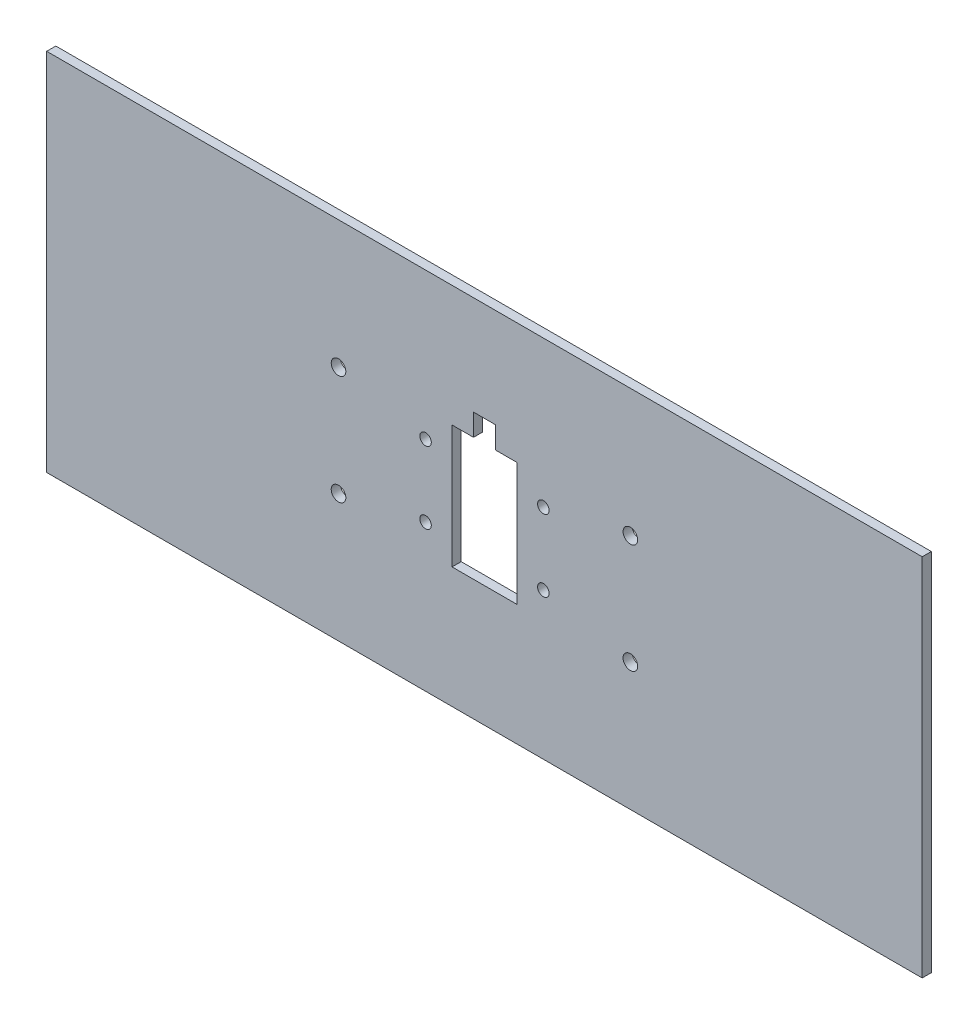
ISO-10303-21;
HEADER;
FILE_DESCRIPTION(('STEP AP214'),'2;1');
FILE_NAME('part.step','',(''),(''),'','','');
FILE_SCHEMA(('AUTOMOTIVE_DESIGN { 1 0 10303 214 1 1 1 1 }'));
ENDSEC;
DATA;
#1=APPLICATION_CONTEXT('core data for automotive mechanical design processes');
#2=APPLICATION_PROTOCOL_DEFINITION('international standard','automotive_design',2000,#1);
#3=PRODUCT_CONTEXT('',#1,'mechanical');
#4=PRODUCT('Part','Part','',(#3));
#5=PRODUCT_RELATED_PRODUCT_CATEGORY('part','',(#4));
#6=PRODUCT_DEFINITION_FORMATION('','',#4);
#7=PRODUCT_DEFINITION_CONTEXT('part definition',#1,'design');
#8=PRODUCT_DEFINITION('design','',#6,#7);
#9=PRODUCT_DEFINITION_SHAPE('','',#8);
#10=(LENGTH_UNIT() NAMED_UNIT(*) SI_UNIT(.MILLI.,.METRE.));
#11=(NAMED_UNIT(*) PLANE_ANGLE_UNIT() SI_UNIT($,.RADIAN.));
#12=(NAMED_UNIT(*) SI_UNIT($,.STERADIAN.) SOLID_ANGLE_UNIT());
#13=UNCERTAINTY_MEASURE_WITH_UNIT(LENGTH_MEASURE(1.E-05),#10,'distance_accuracy_value','');
#14=(GEOMETRIC_REPRESENTATION_CONTEXT(3) GLOBAL_UNCERTAINTY_ASSIGNED_CONTEXT((#13)) GLOBAL_UNIT_ASSIGNED_CONTEXT((#10,
#11,#12)) REPRESENTATION_CONTEXT('',''));
#15=CARTESIAN_POINT('',(0.,0.,0.));
#16=DIRECTION('',(0.,0.,1.));
#17=DIRECTION('',(1.,0.,0.));
#18=AXIS2_PLACEMENT_3D('',#15,#16,#17);
#19=CARTESIAN_POINT('',(-152.4,-63.5,3.175));
#20=DIRECTION('',(1.,0.,0.));
#21=DIRECTION('',(0.,1.,0.));
#22=AXIS2_PLACEMENT_3D('',#19,#20,#21);
#23=PLANE('',#22);
#24=DIRECTION('',(0.,-1.,0.));
#25=VECTOR('',#24,1.);
#26=CARTESIAN_POINT('',(-152.4,-63.5,0.));
#27=LINE('',#26,#25);
#28=CARTESIAN_POINT('',(-152.4,63.5,0.));
#29=VERTEX_POINT('',#28);
#30=CARTESIAN_POINT('',(-152.4,-63.5,0.));
#31=VERTEX_POINT('',#30);
#32=EDGE_CURVE('E205',#29,#31,#27,.T.);
#33=ORIENTED_EDGE('',*,*,#32,.T.);
#34=DIRECTION('',(0.,0.,-1.));
#35=VECTOR('',#34,1.);
#36=CARTESIAN_POINT('',(-152.4,-63.5,3.175));
#37=LINE('',#36,#35);
#38=CARTESIAN_POINT('',(-152.4,-63.5,3.175));
#39=VERTEX_POINT('',#38);
#40=EDGE_CURVE('E234',#39,#31,#37,.T.);
#41=ORIENTED_EDGE('',*,*,#40,.F.);
#42=DIRECTION('',(0.,-1.,0.));
#43=VECTOR('',#42,1.);
#44=CARTESIAN_POINT('',(-152.4,-63.5,3.175));
#45=LINE('',#44,#43);
#46=CARTESIAN_POINT('',(-152.4,63.5,3.175));
#47=VERTEX_POINT('',#46);
#48=EDGE_CURVE('E208',#47,#39,#45,.T.);
#49=ORIENTED_EDGE('',*,*,#48,.F.);
#50=DIRECTION('',(0.,0.,-1.));
#51=VECTOR('',#50,1.);
#52=CARTESIAN_POINT('',(-152.4,63.5,3.175));
#53=LINE('',#52,#51);
#54=EDGE_CURVE('E218',#47,#29,#53,.T.);
#55=ORIENTED_EDGE('',*,*,#54,.T.);
#56=EDGE_LOOP('',(#33,#41,#49,#55));
#57=FACE_BOUND('',#56,.T.);
#58=ADVANCED_FACE('F36',(#57),#23,.F.);
#59=CARTESIAN_POINT('',(-152.4,-63.5,3.175));
#60=DIRECTION('',(0.,1.,0.));
#61=DIRECTION('',(0.,0.,1.));
#62=AXIS2_PLACEMENT_3D('',#59,#60,#61);
#63=PLANE('',#62);
#64=DIRECTION('',(1.,0.,0.));
#65=VECTOR('',#64,1.);
#66=CARTESIAN_POINT('',(-152.4,-63.5,0.));
#67=LINE('',#66,#65);
#68=CARTESIAN_POINT('',(152.4,-63.5,0.));
#69=VERTEX_POINT('',#68);
#70=EDGE_CURVE('E221',#31,#69,#67,.T.);
#71=ORIENTED_EDGE('',*,*,#70,.T.);
#72=DIRECTION('',(0.,0.,-1.));
#73=VECTOR('',#72,1.);
#74=CARTESIAN_POINT('',(152.4,-63.5,3.175));
#75=LINE('',#74,#73);
#76=CARTESIAN_POINT('',(152.4,-63.5,3.175));
#77=VERTEX_POINT('',#76);
#78=EDGE_CURVE('E231',#77,#69,#75,.T.);
#79=ORIENTED_EDGE('',*,*,#78,.F.);
#80=DIRECTION('',(1.,0.,0.));
#81=VECTOR('',#80,1.);
#82=CARTESIAN_POINT('',(-152.4,-63.5,3.175));
#83=LINE('',#82,#81);
#84=EDGE_CURVE('E211',#39,#77,#83,.T.);
#85=ORIENTED_EDGE('',*,*,#84,.F.);
#86=ORIENTED_EDGE('',*,*,#40,.T.);
#87=EDGE_LOOP('',(#71,#79,#85,#86));
#88=FACE_BOUND('',#87,.T.);
#89=ADVANCED_FACE('F300',(#88),#63,.F.);
#90=CARTESIAN_POINT('',(152.4,-63.5,3.175));
#91=DIRECTION('',(-1.,0.,0.));
#92=DIRECTION('',(0.,-1.,0.));
#93=AXIS2_PLACEMENT_3D('',#90,#91,#92);
#94=PLANE('',#93);
#95=DIRECTION('',(0.,1.,0.));
#96=VECTOR('',#95,1.);
#97=CARTESIAN_POINT('',(152.4,-63.5,0.));
#98=LINE('',#97,#96);
#99=CARTESIAN_POINT('',(152.4,63.5,0.));
#100=VERTEX_POINT('',#99);
#101=EDGE_CURVE('E223',#69,#100,#98,.T.);
#102=ORIENTED_EDGE('',*,*,#101,.T.);
#103=DIRECTION('',(0.,0.,-1.));
#104=VECTOR('',#103,1.);
#105=CARTESIAN_POINT('',(152.4,63.5,3.175));
#106=LINE('',#105,#104);
#107=CARTESIAN_POINT('',(152.4,63.5,3.175));
#108=VERTEX_POINT('',#107);
#109=EDGE_CURVE('E228',#108,#100,#106,.T.);
#110=ORIENTED_EDGE('',*,*,#109,.F.);
#111=DIRECTION('',(0.,1.,0.));
#112=VECTOR('',#111,1.);
#113=CARTESIAN_POINT('',(152.4,-63.5,3.175));
#114=LINE('',#113,#112);
#115=EDGE_CURVE('E214',#77,#108,#114,.T.);
#116=ORIENTED_EDGE('',*,*,#115,.F.);
#117=ORIENTED_EDGE('',*,*,#78,.T.);
#118=EDGE_LOOP('',(#102,#110,#116,#117));
#119=FACE_BOUND('',#118,.T.);
#120=ADVANCED_FACE('F297',(#119),#94,.F.);
#121=CARTESIAN_POINT('',(-152.4,63.5,3.175));
#122=DIRECTION('',(0.,-1.,0.));
#123=DIRECTION('',(0.,0.,-1.));
#124=AXIS2_PLACEMENT_3D('',#121,#122,#123);
#125=PLANE('',#124);
#126=DIRECTION('',(-1.,0.,0.));
#127=VECTOR('',#126,1.);
#128=CARTESIAN_POINT('',(-152.4,63.5,0.));
#129=LINE('',#128,#127);
#130=EDGE_CURVE('E212',#100,#29,#129,.T.);
#131=ORIENTED_EDGE('',*,*,#130,.T.);
#132=ORIENTED_EDGE('',*,*,#54,.F.);
#133=DIRECTION('',(-1.,0.,0.));
#134=VECTOR('',#133,1.);
#135=CARTESIAN_POINT('',(-152.4,63.5,3.175));
#136=LINE('',#135,#134);
#137=EDGE_CURVE('E216',#108,#47,#136,.T.);
#138=ORIENTED_EDGE('',*,*,#137,.F.);
#139=ORIENTED_EDGE('',*,*,#109,.T.);
#140=EDGE_LOOP('',(#131,#132,#138,#139));
#141=FACE_BOUND('',#140,.T.);
#142=ADVANCED_FACE('F293',(#141),#125,.F.);
#143=CARTESIAN_POINT('',(0.,0.,3.175));
#144=DIRECTION('',(0.,0.,-1.));
#145=DIRECTION('',(-1.,0.,0.));
#146=AXIS2_PLACEMENT_3D('',#143,#144,#145);
#147=PLANE('',#146);
#148=CARTESIAN_POINT('',(20.5,12.5,3.175));
#149=DIRECTION('',(0.,0.,-1.));
#150=DIRECTION('',(-1.,0.,0.));
#151=AXIS2_PLACEMENT_3D('',#148,#149,#150);
#152=CIRCLE('',#151,2.);
#153=CARTESIAN_POINT('',(18.5,12.5,3.175));
#154=VERTEX_POINT('',#153);
#155=EDGE_CURVE('E144',#154,#154,#152,.T.);
#156=ORIENTED_EDGE('',*,*,#155,.T.);
#157=EDGE_LOOP('',(#156));
#158=FACE_BOUND('',#157,.T.);
#159=CARTESIAN_POINT('',(-20.5,-12.5,3.175));
#160=DIRECTION('',(0.,0.,-1.));
#161=DIRECTION('',(-1.,0.,0.));
#162=AXIS2_PLACEMENT_3D('',#159,#160,#161);
#163=CIRCLE('',#162,2.);
#164=CARTESIAN_POINT('',(-22.5,-12.5,3.175));
#165=VERTEX_POINT('',#164);
#166=EDGE_CURVE('E147',#165,#165,#163,.T.);
#167=ORIENTED_EDGE('',*,*,#166,.T.);
#168=EDGE_LOOP('',(#167));
#169=FACE_BOUND('',#168,.T.);
#170=CARTESIAN_POINT('',(-20.5,12.5,3.175));
#171=DIRECTION('',(0.,0.,-1.));
#172=DIRECTION('',(-1.,0.,0.));
#173=AXIS2_PLACEMENT_3D('',#170,#171,#172);
#174=CIRCLE('',#173,2.);
#175=CARTESIAN_POINT('',(-22.5,12.5,3.175));
#176=VERTEX_POINT('',#175);
#177=EDGE_CURVE('E547',#176,#176,#174,.T.);
#178=ORIENTED_EDGE('',*,*,#177,.T.);
#179=EDGE_LOOP('',(#178));
#180=FACE_BOUND('',#179,.T.);
#181=CARTESIAN_POINT('',(20.5,-12.5,3.175));
#182=DIRECTION('',(0.,0.,-1.));
#183=DIRECTION('',(-1.,0.,0.));
#184=AXIS2_PLACEMENT_3D('',#181,#182,#183);
#185=CIRCLE('',#184,2.);
#186=CARTESIAN_POINT('',(18.5,-12.5,3.175));
#187=VERTEX_POINT('',#186);
#188=EDGE_CURVE('E549',#187,#187,#185,.T.);
#189=ORIENTED_EDGE('',*,*,#188,.T.);
#190=EDGE_LOOP('',(#189));
#191=FACE_BOUND('',#190,.T.);
#192=DIRECTION('',(0.,-1.,0.));
#193=VECTOR('',#192,1.);
#194=CARTESIAN_POINT('',(3.80999999999999,21.395,3.175));
#195=LINE('',#194,#193);
#196=CARTESIAN_POINT('',(3.80999999999999,29.015,3.175));
#197=VERTEX_POINT('',#196);
#198=CARTESIAN_POINT('',(3.80999999999999,21.395,3.175));
#199=VERTEX_POINT('',#198);
#200=EDGE_CURVE('E133',#197,#199,#195,.T.);
#201=ORIENTED_EDGE('',*,*,#200,.T.);
#202=DIRECTION('',(1.,0.,0.));
#203=VECTOR('',#202,1.);
#204=CARTESIAN_POINT('',(3.80999999999999,21.395,3.175));
#205=LINE('',#204,#203);
#206=CARTESIAN_POINT('',(11.27,21.395,3.175));
#207=VERTEX_POINT('',#206);
#208=EDGE_CURVE('E128',#199,#207,#205,.T.);
#209=ORIENTED_EDGE('',*,*,#208,.T.);
#210=DIRECTION('',(0.,-1.,0.));
#211=VECTOR('',#210,1.);
#212=CARTESIAN_POINT('',(11.27,21.395,3.175));
#213=LINE('',#212,#211);
#214=CARTESIAN_POINT('',(11.27,-21.395,3.175));
#215=VERTEX_POINT('',#214);
#216=EDGE_CURVE('E136',#207,#215,#213,.T.);
#217=ORIENTED_EDGE('',*,*,#216,.T.);
#218=DIRECTION('',(-1.,0.,0.));
#219=VECTOR('',#218,1.);
#220=CARTESIAN_POINT('',(-11.27,-21.395,3.175));
#221=LINE('',#220,#219);
#222=CARTESIAN_POINT('',(-11.27,-21.395,3.175));
#223=VERTEX_POINT('',#222);
#224=EDGE_CURVE('E52',#215,#223,#221,.T.);
#225=ORIENTED_EDGE('',*,*,#224,.T.);
#226=DIRECTION('',(0.,1.,0.));
#227=VECTOR('',#226,1.);
#228=CARTESIAN_POINT('',(-11.27,21.395,3.175));
#229=LINE('',#228,#227);
#230=CARTESIAN_POINT('',(-11.27,21.395,3.175));
#231=VERTEX_POINT('',#230);
#232=EDGE_CURVE('E152',#223,#231,#229,.T.);
#233=ORIENTED_EDGE('',*,*,#232,.T.);
#234=DIRECTION('',(1.,0.,0.));
#235=VECTOR('',#234,1.);
#236=CARTESIAN_POINT('',(-11.27,21.395,3.175));
#237=LINE('',#236,#235);
#238=CARTESIAN_POINT('',(-3.81000000000001,21.395,3.175));
#239=VERTEX_POINT('',#238);
#240=EDGE_CURVE('E155',#231,#239,#237,.T.);
#241=ORIENTED_EDGE('',*,*,#240,.T.);
#242=DIRECTION('',(0.,1.,0.));
#243=VECTOR('',#242,1.);
#244=CARTESIAN_POINT('',(-3.81000000000001,29.015,3.175));
#245=LINE('',#244,#243);
#246=CARTESIAN_POINT('',(-3.81000000000001,29.015,3.175));
#247=VERTEX_POINT('',#246);
#248=EDGE_CURVE('E158',#239,#247,#245,.T.);
#249=ORIENTED_EDGE('',*,*,#248,.T.);
#250=DIRECTION('',(1.,0.,0.));
#251=VECTOR('',#250,1.);
#252=CARTESIAN_POINT('',(3.80999999999999,29.015,3.175));
#253=LINE('',#252,#251);
#254=EDGE_CURVE('E161',#247,#197,#253,.T.);
#255=ORIENTED_EDGE('',*,*,#254,.T.);
#256=EDGE_LOOP('',(#201,#209,#217,#225,#233,#241,#249,#255));
#257=FACE_BOUND('',#256,.T.);
#258=CARTESIAN_POINT('',(-50.8,19.05,3.175));
#259=DIRECTION('',(0.,0.,1.));
#260=DIRECTION('',(1.,0.,0.));
#261=AXIS2_PLACEMENT_3D('',#258,#259,#260);
#262=CIRCLE('',#261,2.54);
#263=CARTESIAN_POINT('',(-48.26,19.05,3.175));
#264=VERTEX_POINT('',#263);
#265=EDGE_CURVE('E199',#264,#264,#262,.T.);
#266=ORIENTED_EDGE('',*,*,#265,.F.);
#267=EDGE_LOOP('',(#266));
#268=FACE_BOUND('',#267,.T.);
#269=CARTESIAN_POINT('',(50.8,-19.05,3.175));
#270=DIRECTION('',(0.,0.,1.));
#271=DIRECTION('',(1.,0.,0.));
#272=AXIS2_PLACEMENT_3D('',#269,#270,#271);
#273=CIRCLE('',#272,2.54);
#274=CARTESIAN_POINT('',(53.34,-19.05,3.175));
#275=VERTEX_POINT('',#274);
#276=EDGE_CURVE('E193',#275,#275,#273,.T.);
#277=ORIENTED_EDGE('',*,*,#276,.F.);
#278=EDGE_LOOP('',(#277));
#279=FACE_BOUND('',#278,.T.);
#280=CARTESIAN_POINT('',(-50.8,-19.05,3.175));
#281=DIRECTION('',(0.,0.,1.));
#282=DIRECTION('',(1.,0.,0.));
#283=AXIS2_PLACEMENT_3D('',#280,#281,#282);
#284=CIRCLE('',#283,2.54);
#285=CARTESIAN_POINT('',(-48.26,-19.05,3.175));
#286=VERTEX_POINT('',#285);
#287=EDGE_CURVE('E187',#286,#286,#284,.T.);
#288=ORIENTED_EDGE('',*,*,#287,.F.);
#289=EDGE_LOOP('',(#288));
#290=FACE_BOUND('',#289,.T.);
#291=CARTESIAN_POINT('',(50.8,19.05,3.175));
#292=DIRECTION('',(0.,0.,1.));
#293=DIRECTION('',(1.,0.,0.));
#294=AXIS2_PLACEMENT_3D('',#291,#292,#293);
#295=CIRCLE('',#294,2.54000000000001);
#296=CARTESIAN_POINT('',(53.34,19.05,3.175));
#297=VERTEX_POINT('',#296);
#298=EDGE_CURVE('E186',#297,#297,#295,.T.);
#299=ORIENTED_EDGE('',*,*,#298,.F.);
#300=EDGE_LOOP('',(#299));
#301=FACE_BOUND('',#300,.T.);
#302=ORIENTED_EDGE('',*,*,#48,.T.);
#303=ORIENTED_EDGE('',*,*,#84,.T.);
#304=ORIENTED_EDGE('',*,*,#115,.T.);
#305=ORIENTED_EDGE('',*,*,#137,.T.);
#306=EDGE_LOOP('',(#302,#303,#304,#305));
#307=FACE_BOUND('',#306,.T.);
#308=ADVANCED_FACE('F140',(#158,#169,#180,#191,#257,#268,#279,#290,#301,#307),#147,.F.);
#309=CARTESIAN_POINT('',(0.,0.,0.));
#310=DIRECTION('',(0.,0.,-1.));
#311=DIRECTION('',(-1.,0.,0.));
#312=AXIS2_PLACEMENT_3D('',#309,#310,#311);
#313=PLANE('',#312);
#314=CARTESIAN_POINT('',(20.5,12.5,0.));
#315=DIRECTION('',(0.,0.,-1.));
#316=DIRECTION('',(-1.,0.,0.));
#317=AXIS2_PLACEMENT_3D('',#314,#315,#316);
#318=CIRCLE('',#317,2.);
#319=CARTESIAN_POINT('',(18.5,12.5,0.));
#320=VERTEX_POINT('',#319);
#321=EDGE_CURVE('E39',#320,#320,#318,.T.);
#322=ORIENTED_EDGE('',*,*,#321,.F.);
#323=EDGE_LOOP('',(#322));
#324=FACE_BOUND('',#323,.T.);
#325=CARTESIAN_POINT('',(-20.5,-12.5,0.));
#326=DIRECTION('',(0.,0.,-1.));
#327=DIRECTION('',(-1.,0.,0.));
#328=AXIS2_PLACEMENT_3D('',#325,#326,#327);
#329=CIRCLE('',#328,2.);
#330=CARTESIAN_POINT('',(-22.5,-12.5,0.));
#331=VERTEX_POINT('',#330);
#332=EDGE_CURVE('E254',#331,#331,#329,.T.);
#333=ORIENTED_EDGE('',*,*,#332,.F.);
#334=EDGE_LOOP('',(#333));
#335=FACE_BOUND('',#334,.T.);
#336=CARTESIAN_POINT('',(-20.5,12.5,0.));
#337=DIRECTION('',(0.,0.,-1.));
#338=DIRECTION('',(-1.,0.,0.));
#339=AXIS2_PLACEMENT_3D('',#336,#337,#338);
#340=CIRCLE('',#339,2.);
#341=CARTESIAN_POINT('',(-22.5,12.5,0.));
#342=VERTEX_POINT('',#341);
#343=EDGE_CURVE('E252',#342,#342,#340,.T.);
#344=ORIENTED_EDGE('',*,*,#343,.F.);
#345=EDGE_LOOP('',(#344));
#346=FACE_BOUND('',#345,.T.);
#347=CARTESIAN_POINT('',(20.5,-12.5,0.));
#348=DIRECTION('',(0.,0.,-1.));
#349=DIRECTION('',(-1.,0.,0.));
#350=AXIS2_PLACEMENT_3D('',#347,#348,#349);
#351=CIRCLE('',#350,2.);
#352=CARTESIAN_POINT('',(18.5,-12.5,0.));
#353=VERTEX_POINT('',#352);
#354=EDGE_CURVE('E166',#353,#353,#351,.T.);
#355=ORIENTED_EDGE('',*,*,#354,.F.);
#356=EDGE_LOOP('',(#355));
#357=FACE_BOUND('',#356,.T.);
#358=DIRECTION('',(1.,0.,0.));
#359=VECTOR('',#358,1.);
#360=CARTESIAN_POINT('',(0.,21.395,0.));
#361=LINE('',#360,#359);
#362=CARTESIAN_POINT('',(3.80999999999999,21.395,0.));
#363=VERTEX_POINT('',#362);
#364=CARTESIAN_POINT('',(11.27,21.395,0.));
#365=VERTEX_POINT('',#364);
#366=EDGE_CURVE('E11',#363,#365,#361,.T.);
#367=ORIENTED_EDGE('',*,*,#366,.F.);
#368=DIRECTION('',(0.,-1.,0.));
#369=VECTOR('',#368,1.);
#370=CARTESIAN_POINT('',(3.80999999999997,0.,0.));
#371=LINE('',#370,#369);
#372=CARTESIAN_POINT('',(3.80999999999999,29.015,0.));
#373=VERTEX_POINT('',#372);
#374=EDGE_CURVE('E44',#373,#363,#371,.T.);
#375=ORIENTED_EDGE('',*,*,#374,.F.);
#376=DIRECTION('',(1.,0.,0.));
#377=VECTOR('',#376,1.);
#378=CARTESIAN_POINT('',(0.,29.015,0.));
#379=LINE('',#378,#377);
#380=CARTESIAN_POINT('',(-3.81000000000001,29.015,0.));
#381=VERTEX_POINT('',#380);
#382=EDGE_CURVE('E247',#381,#373,#379,.T.);
#383=ORIENTED_EDGE('',*,*,#382,.F.);
#384=DIRECTION('',(0.,1.,0.));
#385=VECTOR('',#384,1.);
#386=CARTESIAN_POINT('',(-3.81000000000001,0.,0.));
#387=LINE('',#386,#385);
#388=CARTESIAN_POINT('',(-3.81000000000001,21.395,0.));
#389=VERTEX_POINT('',#388);
#390=EDGE_CURVE('E245',#389,#381,#387,.T.);
#391=ORIENTED_EDGE('',*,*,#390,.F.);
#392=DIRECTION('',(1.,0.,0.));
#393=VECTOR('',#392,1.);
#394=CARTESIAN_POINT('',(1.29353167289761E-13,21.395,0.));
#395=LINE('',#394,#393);
#396=CARTESIAN_POINT('',(-11.27,21.395,0.));
#397=VERTEX_POINT('',#396);
#398=EDGE_CURVE('E243',#397,#389,#395,.T.);
#399=ORIENTED_EDGE('',*,*,#398,.F.);
#400=DIRECTION('',(0.,1.,0.));
#401=VECTOR('',#400,1.);
#402=CARTESIAN_POINT('',(-11.27,0.,0.));
#403=LINE('',#402,#401);
#404=CARTESIAN_POINT('',(-11.27,-21.395,0.));
#405=VERTEX_POINT('',#404);
#406=EDGE_CURVE('E241',#405,#397,#403,.T.);
#407=ORIENTED_EDGE('',*,*,#406,.F.);
#408=DIRECTION('',(-1.,0.,0.));
#409=VECTOR('',#408,1.);
#410=CARTESIAN_POINT('',(0.,-21.395,0.));
#411=LINE('',#410,#409);
#412=CARTESIAN_POINT('',(11.27,-21.395,0.));
#413=VERTEX_POINT('',#412);
#414=EDGE_CURVE('E239',#413,#405,#411,.T.);
#415=ORIENTED_EDGE('',*,*,#414,.F.);
#416=DIRECTION('',(0.,-1.,0.));
#417=VECTOR('',#416,1.);
#418=CARTESIAN_POINT('',(11.27,0.,0.));
#419=LINE('',#418,#417);
#420=EDGE_CURVE('E237',#365,#413,#419,.T.);
#421=ORIENTED_EDGE('',*,*,#420,.F.);
#422=EDGE_LOOP('',(#367,#375,#383,#391,#399,#407,#415,#421));
#423=FACE_BOUND('',#422,.T.);
#424=CARTESIAN_POINT('',(-50.8,19.05,0.));
#425=DIRECTION('',(0.,0.,1.));
#426=DIRECTION('',(1.,0.,0.));
#427=AXIS2_PLACEMENT_3D('',#424,#425,#426);
#428=CIRCLE('',#427,2.54);
#429=CARTESIAN_POINT('',(-48.26,19.05,0.));
#430=VERTEX_POINT('',#429);
#431=EDGE_CURVE('E196',#430,#430,#428,.T.);
#432=ORIENTED_EDGE('',*,*,#431,.T.);
#433=EDGE_LOOP('',(#432));
#434=FACE_BOUND('',#433,.T.);
#435=CARTESIAN_POINT('',(50.8,-19.05,0.));
#436=DIRECTION('',(0.,0.,1.));
#437=DIRECTION('',(1.,0.,0.));
#438=AXIS2_PLACEMENT_3D('',#435,#436,#437);
#439=CIRCLE('',#438,2.54);
#440=CARTESIAN_POINT('',(53.34,-19.05,0.));
#441=VERTEX_POINT('',#440);
#442=EDGE_CURVE('E190',#441,#441,#439,.T.);
#443=ORIENTED_EDGE('',*,*,#442,.T.);
#444=EDGE_LOOP('',(#443));
#445=FACE_BOUND('',#444,.T.);
#446=CARTESIAN_POINT('',(-50.8,-19.05,0.));
#447=DIRECTION('',(0.,0.,1.));
#448=DIRECTION('',(1.,0.,0.));
#449=AXIS2_PLACEMENT_3D('',#446,#447,#448);
#450=CIRCLE('',#449,2.54);
#451=CARTESIAN_POINT('',(-48.26,-19.05,0.));
#452=VERTEX_POINT('',#451);
#453=EDGE_CURVE('E183',#452,#452,#450,.T.);
#454=ORIENTED_EDGE('',*,*,#453,.T.);
#455=EDGE_LOOP('',(#454));
#456=FACE_BOUND('',#455,.T.);
#457=CARTESIAN_POINT('',(50.8,19.05,0.));
#458=DIRECTION('',(0.,0.,1.));
#459=DIRECTION('',(1.,0.,0.));
#460=AXIS2_PLACEMENT_3D('',#457,#458,#459);
#461=CIRCLE('',#460,2.54000000000001);
#462=CARTESIAN_POINT('',(53.34,19.05,0.));
#463=VERTEX_POINT('',#462);
#464=EDGE_CURVE('E202',#463,#463,#461,.T.);
#465=ORIENTED_EDGE('',*,*,#464,.T.);
#466=EDGE_LOOP('',(#465));
#467=FACE_BOUND('',#466,.T.);
#468=ORIENTED_EDGE('',*,*,#32,.F.);
#469=ORIENTED_EDGE('',*,*,#130,.F.);
#470=ORIENTED_EDGE('',*,*,#101,.F.);
#471=ORIENTED_EDGE('',*,*,#70,.F.);
#472=EDGE_LOOP('',(#468,#469,#470,#471));
#473=FACE_BOUND('',#472,.T.);
#474=ADVANCED_FACE('F264',(#324,#335,#346,#357,#423,#434,#445,#456,#467,#473),#313,.T.);
#475=CARTESIAN_POINT('',(50.8,19.05,0.));
#476=DIRECTION('',(0.,0.,1.));
#477=DIRECTION('',(1.,0.,0.));
#478=AXIS2_PLACEMENT_3D('',#475,#476,#477);
#479=CYLINDRICAL_SURFACE('',#478,2.54000000000001);
#480=ORIENTED_EDGE('',*,*,#464,.F.);
#481=EDGE_LOOP('',(#480));
#482=FACE_BOUND('',#481,.T.);
#483=ORIENTED_EDGE('',*,*,#298,.T.);
#484=EDGE_LOOP('',(#483));
#485=FACE_BOUND('',#484,.T.);
#486=ADVANCED_FACE('F267',(#482,#485),#479,.F.);
#487=CARTESIAN_POINT('',(-50.8,-19.05,0.));
#488=DIRECTION('',(0.,0.,1.));
#489=DIRECTION('',(1.,0.,0.));
#490=AXIS2_PLACEMENT_3D('',#487,#488,#489);
#491=CYLINDRICAL_SURFACE('',#490,2.54);
#492=ORIENTED_EDGE('',*,*,#453,.F.);
#493=EDGE_LOOP('',(#492));
#494=FACE_BOUND('',#493,.T.);
#495=ORIENTED_EDGE('',*,*,#287,.T.);
#496=EDGE_LOOP('',(#495));
#497=FACE_BOUND('',#496,.T.);
#498=ADVANCED_FACE('F368',(#494,#497),#491,.F.);
#499=CARTESIAN_POINT('',(50.8,-19.05,0.));
#500=DIRECTION('',(0.,0.,1.));
#501=DIRECTION('',(1.,0.,0.));
#502=AXIS2_PLACEMENT_3D('',#499,#500,#501);
#503=CYLINDRICAL_SURFACE('',#502,2.54);
#504=ORIENTED_EDGE('',*,*,#442,.F.);
#505=EDGE_LOOP('',(#504));
#506=FACE_BOUND('',#505,.T.);
#507=ORIENTED_EDGE('',*,*,#276,.T.);
#508=EDGE_LOOP('',(#507));
#509=FACE_BOUND('',#508,.T.);
#510=ADVANCED_FACE('F377',(#506,#509),#503,.F.);
#511=CARTESIAN_POINT('',(-50.8,19.05,0.));
#512=DIRECTION('',(0.,0.,1.));
#513=DIRECTION('',(1.,0.,0.));
#514=AXIS2_PLACEMENT_3D('',#511,#512,#513);
#515=CYLINDRICAL_SURFACE('',#514,2.54);
#516=ORIENTED_EDGE('',*,*,#431,.F.);
#517=EDGE_LOOP('',(#516));
#518=FACE_BOUND('',#517,.T.);
#519=ORIENTED_EDGE('',*,*,#265,.T.);
#520=EDGE_LOOP('',(#519));
#521=FACE_BOUND('',#520,.T.);
#522=ADVANCED_FACE('F386',(#518,#521),#515,.F.);
#523=CARTESIAN_POINT('',(3.80999999999999,21.395,3.175));
#524=DIRECTION('',(0.,1.,0.));
#525=DIRECTION('',(-1.,0.,0.));
#526=AXIS2_PLACEMENT_3D('',#523,#524,#525);
#527=PLANE('',#526);
#528=ORIENTED_EDGE('',*,*,#366,.T.);
#529=DIRECTION('',(0.,0.,-1.));
#530=VECTOR('',#529,1.);
#531=CARTESIAN_POINT('',(11.27,21.395,3.175));
#532=LINE('',#531,#530);
#533=EDGE_CURVE('E60',#207,#365,#532,.T.);
#534=ORIENTED_EDGE('',*,*,#533,.F.);
#535=ORIENTED_EDGE('',*,*,#208,.F.);
#536=DIRECTION('',(0.,0.,-1.));
#537=VECTOR('',#536,1.);
#538=CARTESIAN_POINT('',(3.80999999999999,21.395,3.175));
#539=LINE('',#538,#537);
#540=EDGE_CURVE('E164',#199,#363,#539,.T.);
#541=ORIENTED_EDGE('',*,*,#540,.T.);
#542=EDGE_LOOP('',(#528,#534,#535,#541));
#543=FACE_BOUND('',#542,.T.);
#544=ADVANCED_FACE('F125',(#543),#527,.F.);
#545=CARTESIAN_POINT('',(3.80999999999999,21.395,3.175));
#546=DIRECTION('',(1.,0.,0.));
#547=DIRECTION('',(0.,1.,0.));
#548=AXIS2_PLACEMENT_3D('',#545,#546,#547);
#549=PLANE('',#548);
#550=ORIENTED_EDGE('',*,*,#374,.T.);
#551=ORIENTED_EDGE('',*,*,#540,.F.);
#552=ORIENTED_EDGE('',*,*,#200,.F.);
#553=DIRECTION('',(0.,0.,-1.));
#554=VECTOR('',#553,1.);
#555=CARTESIAN_POINT('',(3.80999999999999,29.015,3.175));
#556=LINE('',#555,#554);
#557=EDGE_CURVE('E167',#197,#373,#556,.T.);
#558=ORIENTED_EDGE('',*,*,#557,.T.);
#559=EDGE_LOOP('',(#550,#551,#552,#558));
#560=FACE_BOUND('',#559,.T.);
#561=ADVANCED_FACE('F403',(#560),#549,.F.);
#562=CARTESIAN_POINT('',(3.80999999999999,29.015,3.175));
#563=DIRECTION('',(0.,1.,0.));
#564=DIRECTION('',(0.,0.,1.));
#565=AXIS2_PLACEMENT_3D('',#562,#563,#564);
#566=PLANE('',#565);
#567=ORIENTED_EDGE('',*,*,#382,.T.);
#568=ORIENTED_EDGE('',*,*,#557,.F.);
#569=ORIENTED_EDGE('',*,*,#254,.F.);
#570=DIRECTION('',(0.,0.,-1.));
#571=VECTOR('',#570,1.);
#572=CARTESIAN_POINT('',(-3.81000000000001,29.015,3.175));
#573=LINE('',#572,#571);
#574=EDGE_CURVE('E170',#247,#381,#573,.T.);
#575=ORIENTED_EDGE('',*,*,#574,.T.);
#576=EDGE_LOOP('',(#567,#568,#569,#575));
#577=FACE_BOUND('',#576,.T.);
#578=ADVANCED_FACE('F412',(#577),#566,.F.);
#579=CARTESIAN_POINT('',(-3.81000000000001,29.015,3.175));
#580=DIRECTION('',(-1.,0.,0.));
#581=DIRECTION('',(0.,0.,1.));
#582=AXIS2_PLACEMENT_3D('',#579,#580,#581);
#583=PLANE('',#582);
#584=ORIENTED_EDGE('',*,*,#390,.T.);
#585=ORIENTED_EDGE('',*,*,#574,.F.);
#586=ORIENTED_EDGE('',*,*,#248,.F.);
#587=DIRECTION('',(0.,0.,-1.));
#588=VECTOR('',#587,1.);
#589=CARTESIAN_POINT('',(-3.81000000000001,21.395,3.175));
#590=LINE('',#589,#588);
#591=EDGE_CURVE('E173',#239,#389,#590,.T.);
#592=ORIENTED_EDGE('',*,*,#591,.T.);
#593=EDGE_LOOP('',(#584,#585,#586,#592));
#594=FACE_BOUND('',#593,.T.);
#595=ADVANCED_FACE('F422',(#594),#583,.F.);
#596=CARTESIAN_POINT('',(-11.27,21.395,3.175));
#597=DIRECTION('',(0.,1.,0.));
#598=DIRECTION('',(-1.,0.,0.));
#599=AXIS2_PLACEMENT_3D('',#596,#597,#598);
#600=PLANE('',#599);
#601=ORIENTED_EDGE('',*,*,#398,.T.);
#602=ORIENTED_EDGE('',*,*,#591,.F.);
#603=ORIENTED_EDGE('',*,*,#240,.F.);
#604=DIRECTION('',(0.,0.,-1.));
#605=VECTOR('',#604,1.);
#606=CARTESIAN_POINT('',(-11.27,21.395,3.175));
#607=LINE('',#606,#605);
#608=EDGE_CURVE('E176',#231,#397,#607,.T.);
#609=ORIENTED_EDGE('',*,*,#608,.T.);
#610=EDGE_LOOP('',(#601,#602,#603,#609));
#611=FACE_BOUND('',#610,.T.);
#612=ADVANCED_FACE('F432',(#611),#600,.F.);
#613=CARTESIAN_POINT('',(-11.27,21.395,3.175));
#614=DIRECTION('',(-1.,0.,0.));
#615=DIRECTION('',(0.,-1.,0.));
#616=AXIS2_PLACEMENT_3D('',#613,#614,#615);
#617=PLANE('',#616);
#618=ORIENTED_EDGE('',*,*,#406,.T.);
#619=ORIENTED_EDGE('',*,*,#608,.F.);
#620=ORIENTED_EDGE('',*,*,#232,.F.);
#621=DIRECTION('',(0.,0.,-1.));
#622=VECTOR('',#621,1.);
#623=CARTESIAN_POINT('',(-11.27,-21.395,3.175));
#624=LINE('',#623,#622);
#625=EDGE_CURVE('E179',#223,#405,#624,.T.);
#626=ORIENTED_EDGE('',*,*,#625,.T.);
#627=EDGE_LOOP('',(#618,#619,#620,#626));
#628=FACE_BOUND('',#627,.T.);
#629=ADVANCED_FACE('F442',(#628),#617,.F.);
#630=CARTESIAN_POINT('',(-11.27,-21.395,3.175));
#631=DIRECTION('',(0.,-1.,0.));
#632=DIRECTION('',(1.,0.,0.));
#633=AXIS2_PLACEMENT_3D('',#630,#631,#632);
#634=PLANE('',#633);
#635=ORIENTED_EDGE('',*,*,#414,.T.);
#636=ORIENTED_EDGE('',*,*,#625,.F.);
#637=ORIENTED_EDGE('',*,*,#224,.F.);
#638=DIRECTION('',(0.,0.,-1.));
#639=VECTOR('',#638,1.);
#640=CARTESIAN_POINT('',(11.27,-21.395,3.175));
#641=LINE('',#640,#639);
#642=EDGE_CURVE('E132',#215,#413,#641,.T.);
#643=ORIENTED_EDGE('',*,*,#642,.T.);
#644=EDGE_LOOP('',(#635,#636,#637,#643));
#645=FACE_BOUND('',#644,.T.);
#646=ADVANCED_FACE('F452',(#645),#634,.F.);
#647=CARTESIAN_POINT('',(11.27,21.395,3.175));
#648=DIRECTION('',(1.,0.,0.));
#649=DIRECTION('',(0.,1.,0.));
#650=AXIS2_PLACEMENT_3D('',#647,#648,#649);
#651=PLANE('',#650);
#652=ORIENTED_EDGE('',*,*,#420,.T.);
#653=ORIENTED_EDGE('',*,*,#642,.F.);
#654=ORIENTED_EDGE('',*,*,#216,.F.);
#655=ORIENTED_EDGE('',*,*,#533,.T.);
#656=EDGE_LOOP('',(#652,#653,#654,#655));
#657=FACE_BOUND('',#656,.T.);
#658=ADVANCED_FACE('F137',(#657),#651,.F.);
#659=CARTESIAN_POINT('',(20.5,-12.5,3.175));
#660=DIRECTION('',(0.,0.,-1.));
#661=DIRECTION('',(-1.,0.,0.));
#662=AXIS2_PLACEMENT_3D('',#659,#660,#661);
#663=CYLINDRICAL_SURFACE('',#662,2.);
#664=ORIENTED_EDGE('',*,*,#354,.T.);
#665=EDGE_LOOP('',(#664));
#666=FACE_BOUND('',#665,.T.);
#667=ORIENTED_EDGE('',*,*,#188,.F.);
#668=EDGE_LOOP('',(#667));
#669=FACE_BOUND('',#668,.T.);
#670=ADVANCED_FACE('F470',(#666,#669),#663,.F.);
#671=CARTESIAN_POINT('',(-20.5,12.5,3.175));
#672=DIRECTION('',(0.,0.,-1.));
#673=DIRECTION('',(-1.,0.,0.));
#674=AXIS2_PLACEMENT_3D('',#671,#672,#673);
#675=CYLINDRICAL_SURFACE('',#674,2.);
#676=ORIENTED_EDGE('',*,*,#343,.T.);
#677=EDGE_LOOP('',(#676));
#678=FACE_BOUND('',#677,.T.);
#679=ORIENTED_EDGE('',*,*,#177,.F.);
#680=EDGE_LOOP('',(#679));
#681=FACE_BOUND('',#680,.T.);
#682=ADVANCED_FACE('F479',(#678,#681),#675,.F.);
#683=CARTESIAN_POINT('',(-20.5,-12.5,3.175));
#684=DIRECTION('',(0.,0.,-1.));
#685=DIRECTION('',(-1.,0.,0.));
#686=AXIS2_PLACEMENT_3D('',#683,#684,#685);
#687=CYLINDRICAL_SURFACE('',#686,2.);
#688=ORIENTED_EDGE('',*,*,#332,.T.);
#689=EDGE_LOOP('',(#688));
#690=FACE_BOUND('',#689,.T.);
#691=ORIENTED_EDGE('',*,*,#166,.F.);
#692=EDGE_LOOP('',(#691));
#693=FACE_BOUND('',#692,.T.);
#694=ADVANCED_FACE('F489',(#690,#693),#687,.F.);
#695=CARTESIAN_POINT('',(20.5,12.5,3.175));
#696=DIRECTION('',(0.,0.,-1.));
#697=DIRECTION('',(-1.,0.,0.));
#698=AXIS2_PLACEMENT_3D('',#695,#696,#697);
#699=CYLINDRICAL_SURFACE('',#698,2.);
#700=ORIENTED_EDGE('',*,*,#321,.T.);
#701=EDGE_LOOP('',(#700));
#702=FACE_BOUND('',#701,.T.);
#703=ORIENTED_EDGE('',*,*,#155,.F.);
#704=EDGE_LOOP('',(#703));
#705=FACE_BOUND('',#704,.T.);
#706=ADVANCED_FACE('F261',(#702,#705),#699,.F.);
#707=CLOSED_SHELL('',(#58,#89,#120,#142,#308,#474,#486,#498,#510,#522,#544,#561,#578,#595,#612,
#629,#646,#658,#670,#682,#694,#706));
#708=MANIFOLD_SOLID_BREP('B2',#707);
#709=ADVANCED_BREP_SHAPE_REPRESENTATION('',(#18,#708),#14);
#710=SHAPE_DEFINITION_REPRESENTATION(#9,#709);
ENDSEC;
END-ISO-10303-21;
